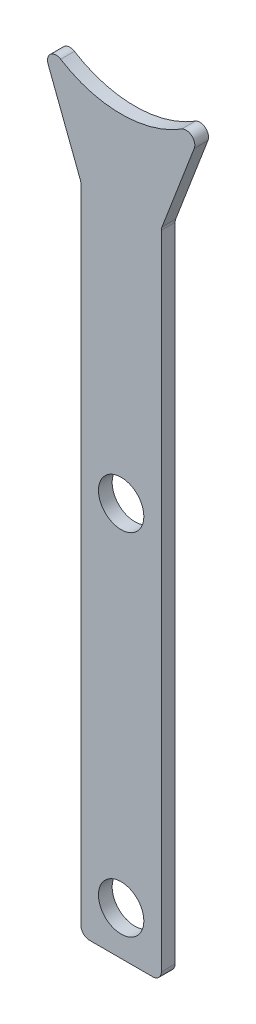
ISO-10303-21;
HEADER;
FILE_DESCRIPTION(('STEP AP214'),'2;1');
FILE_NAME('part.step','',(''),(''),'','','');
FILE_SCHEMA(('AUTOMOTIVE_DESIGN { 1 0 10303 214 1 1 1 1 }'));
ENDSEC;
DATA;
#1=APPLICATION_CONTEXT('core data for automotive mechanical design processes');
#2=APPLICATION_PROTOCOL_DEFINITION('international standard','automotive_design',2000,#1);
#3=PRODUCT_CONTEXT('',#1,'mechanical');
#4=PRODUCT('Part','Part','',(#3));
#5=PRODUCT_RELATED_PRODUCT_CATEGORY('part','',(#4));
#6=PRODUCT_DEFINITION_FORMATION('','',#4);
#7=PRODUCT_DEFINITION_CONTEXT('part definition',#1,'design');
#8=PRODUCT_DEFINITION('design','',#6,#7);
#9=PRODUCT_DEFINITION_SHAPE('','',#8);
#10=(LENGTH_UNIT() NAMED_UNIT(*) SI_UNIT(.MILLI.,.METRE.));
#11=(NAMED_UNIT(*) PLANE_ANGLE_UNIT() SI_UNIT($,.RADIAN.));
#12=(NAMED_UNIT(*) SI_UNIT($,.STERADIAN.) SOLID_ANGLE_UNIT());
#13=UNCERTAINTY_MEASURE_WITH_UNIT(LENGTH_MEASURE(1.E-05),#10,'distance_accuracy_value','');
#14=(GEOMETRIC_REPRESENTATION_CONTEXT(3) GLOBAL_UNCERTAINTY_ASSIGNED_CONTEXT((#13)) GLOBAL_UNIT_ASSIGNED_CONTEXT((#10,
#11,#12)) REPRESENTATION_CONTEXT('',''));
#15=CARTESIAN_POINT('',(0.,0.,0.));
#16=DIRECTION('',(0.,0.,1.));
#17=DIRECTION('',(1.,0.,0.));
#18=AXIS2_PLACEMENT_3D('',#15,#16,#17);
#19=CARTESIAN_POINT('',(-1.4426396734848,66.8892607458822,1.5875));
#20=DIRECTION('',(0.,0.,1.));
#21=DIRECTION('',(1.,0.,0.));
#22=AXIS2_PLACEMENT_3D('',#19,#20,#21);
#23=PLANE('',#22);
#24=CARTESIAN_POINT('',(-1.4426396734848,14.6841741500665,1.5875));
#25=DIRECTION('',(0.,0.,1.));
#26=DIRECTION('',(1.,0.,0.));
#27=AXIS2_PLACEMENT_3D('',#24,#25,#26);
#28=CIRCLE('',#27,2.62500000000001);
#29=CARTESIAN_POINT('',(1.18236032651521,14.6841741500665,1.5875));
#30=VERTEX_POINT('',#29);
#31=EDGE_CURVE('E243',#30,#30,#28,.T.);
#32=ORIENTED_EDGE('',*,*,#31,.F.);
#33=EDGE_LOOP('',(#32));
#34=FACE_BOUND('',#33,.T.);
#35=DIRECTION('',(0.,-1.,0.));
#36=VECTOR('',#35,1.);
#37=CARTESIAN_POINT('',(-6.09963967348479,-30.9023126875583,1.5875));
#38=LINE('',#37,#36);
#39=CARTESIAN_POINT('',(-6.09963967348479,44.3783348947431,1.5875));
#40=VERTEX_POINT('',#39);
#41=CARTESIAN_POINT('',(-6.09963967348479,-29.9023126875583,1.5875));
#42=VERTEX_POINT('',#41);
#43=EDGE_CURVE('E265',#40,#42,#38,.T.);
#44=ORIENTED_EDGE('',*,*,#43,.T.);
#45=CARTESIAN_POINT('',(-5.09963967348479,-29.9023126875583,1.5875));
#46=DIRECTION('',(0.,0.,1.));
#47=DIRECTION('',(1.,0.,0.));
#48=AXIS2_PLACEMENT_3D('',#45,#46,#47);
#49=CIRCLE('',#48,1.);
#50=CARTESIAN_POINT('',(-5.09963967348479,-30.9023126875583,1.5875));
#51=VERTEX_POINT('',#50);
#52=EDGE_CURVE('E194',#42,#51,#49,.T.);
#53=ORIENTED_EDGE('',*,*,#52,.T.);
#54=DIRECTION('',(1.,0.,0.));
#55=VECTOR('',#54,1.);
#56=CARTESIAN_POINT('',(3.21436032651521,-30.9023126875583,1.5875));
#57=LINE('',#56,#55);
#58=CARTESIAN_POINT('',(2.21436032651521,-30.9023126875583,1.5875));
#59=VERTEX_POINT('',#58);
#60=EDGE_CURVE('E151',#51,#59,#57,.T.);
#61=ORIENTED_EDGE('',*,*,#60,.T.);
#62=CARTESIAN_POINT('',(2.21436032651521,-29.9023126875583,1.5875));
#63=DIRECTION('',(0.,0.,1.));
#64=DIRECTION('',(1.,0.,0.));
#65=AXIS2_PLACEMENT_3D('',#62,#63,#64);
#66=CIRCLE('',#65,1.);
#67=CARTESIAN_POINT('',(3.21436032651521,-29.9023126875583,1.5875));
#68=VERTEX_POINT('',#67);
#69=EDGE_CURVE('E191',#59,#68,#66,.T.);
#70=ORIENTED_EDGE('',*,*,#69,.T.);
#71=DIRECTION('',(0.,1.,0.));
#72=VECTOR('',#71,1.);
#73=CARTESIAN_POINT('',(3.21436032651521,-30.9023126875583,1.5875));
#74=LINE('',#73,#72);
#75=CARTESIAN_POINT('',(3.2143603265152,44.3783348947431,1.5875));
#76=VERTEX_POINT('',#75);
#77=EDGE_CURVE('E160',#68,#76,#74,.T.);
#78=ORIENTED_EDGE('',*,*,#77,.T.);
#79=CARTESIAN_POINT('',(4.2143603265152,44.3783348947431,1.5875));
#80=DIRECTION('',(0.,0.,1.));
#81=DIRECTION('',(1.,0.,0.));
#82=AXIS2_PLACEMENT_3D('',#79,#80,#81);
#83=CIRCLE('',#82,1.);
#84=CARTESIAN_POINT('',(3.28051233790704,44.7360050419073,1.5875));
#85=VERTEX_POINT('',#84);
#86=EDGE_CURVE('E11',#76,#85,#83,.F.);
#87=ORIENTED_EDGE('',*,*,#86,.T.);
#88=DIRECTION('',(0.35767014716424,0.933847988608163,0.));
#89=VECTOR('',#88,1.);
#90=CARTESIAN_POINT('',(3.2143603265152,44.5632874604417,1.5875));
#91=LINE('',#90,#89);
#92=CARTESIAN_POINT('',(7.01135624072271,54.4769384188704,1.5875));
#93=VERTEX_POINT('',#92);
#94=EDGE_CURVE('E166',#85,#93,#91,.T.);
#95=ORIENTED_EDGE('',*,*,#94,.T.);
#96=CARTESIAN_POINT('',(6.07750825211454,54.8346085660346,1.5875));
#97=DIRECTION('',(0.,0.,1.));
#98=DIRECTION('',(1.,0.,0.));
#99=AXIS2_PLACEMENT_3D('',#96,#97,#98);
#100=CIRCLE('',#99,1.);
#101=CARTESIAN_POINT('',(5.54821856140513,55.6830497386027,1.5875));
#102=VERTEX_POINT('',#101);
#103=EDGE_CURVE('E186',#93,#102,#100,.T.);
#104=ORIENTED_EDGE('',*,*,#103,.T.);
#105=CARTESIAN_POINT('',(-1.4426396734848,66.8892607458822,1.5875));
#106=DIRECTION('',(0.,0.,-1.));
#107=DIRECTION('',(1.,0.,0.));
#108=AXIS2_PLACEMENT_3D('',#105,#106,#107);
#109=CIRCLE('',#108,13.208);
#110=CARTESIAN_POINT('',(-8.43349790837472,55.6830497386027,1.5875));
#111=VERTEX_POINT('',#110);
#112=EDGE_CURVE('E256',#102,#111,#109,.T.);
#113=ORIENTED_EDGE('',*,*,#112,.T.);
#114=CARTESIAN_POINT('',(-8.96278759908414,54.8346085660346,1.5875));
#115=DIRECTION('',(0.,0.,1.));
#116=DIRECTION('',(1.,0.,0.));
#117=AXIS2_PLACEMENT_3D('',#114,#115,#116);
#118=CIRCLE('',#117,1.);
#119=CARTESIAN_POINT('',(-9.8966355876923,54.4769384188704,1.5875));
#120=VERTEX_POINT('',#119);
#121=EDGE_CURVE('E62',#111,#120,#118,.T.);
#122=ORIENTED_EDGE('',*,*,#121,.T.);
#123=DIRECTION('',(0.357670147164241,-0.933847988608162,0.));
#124=VECTOR('',#123,1.);
#125=CARTESIAN_POINT('',(-11.2712953643843,58.0660645387389,1.5875));
#126=LINE('',#125,#124);
#127=CARTESIAN_POINT('',(-6.16579168487663,44.7360050419073,1.5875));
#128=VERTEX_POINT('',#127);
#129=EDGE_CURVE('E259',#120,#128,#126,.T.);
#130=ORIENTED_EDGE('',*,*,#129,.T.);
#131=CARTESIAN_POINT('',(-7.09963967348479,44.3783348947431,1.5875));
#132=DIRECTION('',(0.,0.,1.));
#133=DIRECTION('',(1.,0.,0.));
#134=AXIS2_PLACEMENT_3D('',#131,#132,#133);
#135=CIRCLE('',#134,1.);
#136=EDGE_CURVE('E227',#128,#40,#135,.F.);
#137=ORIENTED_EDGE('',*,*,#136,.T.);
#138=EDGE_LOOP('',(#44,#53,#61,#70,#78,#87,#95,#104,#113,#122,#130,#137));
#139=FACE_BOUND('',#138,.T.);
#140=CARTESIAN_POINT('',(-1.44263967348479,-25.82882282869,1.5875));
#141=DIRECTION('',(0.,0.,1.));
#142=DIRECTION('',(1.,0.,0.));
#143=AXIS2_PLACEMENT_3D('',#140,#141,#142);
#144=CIRCLE('',#143,2.625);
#145=CARTESIAN_POINT('',(1.1823603265152,-25.82882282869,1.5875));
#146=VERTEX_POINT('',#145);
#147=EDGE_CURVE('E319',#146,#146,#144,.T.);
#148=ORIENTED_EDGE('',*,*,#147,.F.);
#149=EDGE_LOOP('',(#148));
#150=FACE_BOUND('',#149,.T.);
#151=ADVANCED_FACE('F39',(#34,#139,#150),#23,.T.);
#152=CARTESIAN_POINT('',(-1.4426396734848,66.8892607458822,0.));
#153=DIRECTION('',(0.,0.,1.));
#154=DIRECTION('',(1.,0.,0.));
#155=AXIS2_PLACEMENT_3D('',#152,#153,#154);
#156=PLANE('',#155);
#157=DIRECTION('',(1.,0.,0.));
#158=VECTOR('',#157,1.);
#159=CARTESIAN_POINT('',(3.21436032651521,-30.9023126875583,0.));
#160=LINE('',#159,#158);
#161=CARTESIAN_POINT('',(-5.09963967348479,-30.9023126875583,0.));
#162=VERTEX_POINT('',#161);
#163=CARTESIAN_POINT('',(2.21436032651521,-30.9023126875583,0.));
#164=VERTEX_POINT('',#163);
#165=EDGE_CURVE('E148',#162,#164,#160,.T.);
#166=ORIENTED_EDGE('',*,*,#165,.F.);
#167=CARTESIAN_POINT('',(-5.09963967348479,-29.9023126875583,0.));
#168=DIRECTION('',(0.,0.,1.));
#169=DIRECTION('',(1.,0.,0.));
#170=AXIS2_PLACEMENT_3D('',#167,#168,#169);
#171=CIRCLE('',#170,1.);
#172=CARTESIAN_POINT('',(-6.09963967348479,-29.9023126875583,0.));
#173=VERTEX_POINT('',#172);
#174=EDGE_CURVE('E130',#162,#173,#171,.F.);
#175=ORIENTED_EDGE('',*,*,#174,.T.);
#176=DIRECTION('',(0.,-1.,0.));
#177=VECTOR('',#176,1.);
#178=CARTESIAN_POINT('',(-6.09963967348479,-30.9023126875583,0.));
#179=LINE('',#178,#177);
#180=CARTESIAN_POINT('',(-6.09963967348479,44.3783348947431,0.));
#181=VERTEX_POINT('',#180);
#182=EDGE_CURVE('E161',#181,#173,#179,.T.);
#183=ORIENTED_EDGE('',*,*,#182,.F.);
#184=CARTESIAN_POINT('',(-7.09963967348479,44.3783348947431,0.));
#185=DIRECTION('',(0.,0.,1.));
#186=DIRECTION('',(1.,0.,0.));
#187=AXIS2_PLACEMENT_3D('',#184,#185,#186);
#188=CIRCLE('',#187,1.);
#189=CARTESIAN_POINT('',(-6.16579168487663,44.7360050419073,0.));
#190=VERTEX_POINT('',#189);
#191=EDGE_CURVE('E224',#181,#190,#188,.T.);
#192=ORIENTED_EDGE('',*,*,#191,.T.);
#193=DIRECTION('',(0.357670147164241,-0.933847988608162,0.));
#194=VECTOR('',#193,1.);
#195=CARTESIAN_POINT('',(-11.2712953643843,58.0660645387389,0.));
#196=LINE('',#195,#194);
#197=CARTESIAN_POINT('',(-9.8966355876923,54.4769384188704,0.));
#198=VERTEX_POINT('',#197);
#199=EDGE_CURVE('E168',#198,#190,#196,.T.);
#200=ORIENTED_EDGE('',*,*,#199,.F.);
#201=CARTESIAN_POINT('',(-8.96278759908414,54.8346085660346,0.));
#202=DIRECTION('',(0.,0.,1.));
#203=DIRECTION('',(1.,0.,0.));
#204=AXIS2_PLACEMENT_3D('',#201,#202,#203);
#205=CIRCLE('',#204,1.);
#206=CARTESIAN_POINT('',(-8.43349790837472,55.6830497386027,0.));
#207=VERTEX_POINT('',#206);
#208=EDGE_CURVE('E176',#198,#207,#205,.F.);
#209=ORIENTED_EDGE('',*,*,#208,.T.);
#210=CARTESIAN_POINT('',(-1.4426396734848,66.8892607458822,0.));
#211=DIRECTION('',(0.,0.,-1.));
#212=DIRECTION('',(1.,0.,0.));
#213=AXIS2_PLACEMENT_3D('',#210,#211,#212);
#214=CIRCLE('',#213,13.208);
#215=CARTESIAN_POINT('',(5.54821856140513,55.6830497386027,0.));
#216=VERTEX_POINT('',#215);
#217=EDGE_CURVE('E272',#216,#207,#214,.T.);
#218=ORIENTED_EDGE('',*,*,#217,.F.);
#219=CARTESIAN_POINT('',(6.07750825211454,54.8346085660346,0.));
#220=DIRECTION('',(0.,0.,1.));
#221=DIRECTION('',(1.,0.,0.));
#222=AXIS2_PLACEMENT_3D('',#219,#220,#221);
#223=CIRCLE('',#222,1.);
#224=CARTESIAN_POINT('',(7.01135624072271,54.4769384188704,0.));
#225=VERTEX_POINT('',#224);
#226=EDGE_CURVE('E153',#216,#225,#223,.F.);
#227=ORIENTED_EDGE('',*,*,#226,.T.);
#228=DIRECTION('',(0.35767014716424,0.933847988608163,0.));
#229=VECTOR('',#228,1.);
#230=CARTESIAN_POINT('',(3.2143603265152,44.5632874604417,0.));
#231=LINE('',#230,#229);
#232=CARTESIAN_POINT('',(3.28051233790704,44.7360050419073,0.));
#233=VERTEX_POINT('',#232);
#234=EDGE_CURVE('E234',#233,#225,#231,.T.);
#235=ORIENTED_EDGE('',*,*,#234,.F.);
#236=CARTESIAN_POINT('',(4.2143603265152,44.3783348947431,0.));
#237=DIRECTION('',(0.,0.,1.));
#238=DIRECTION('',(1.,0.,0.));
#239=AXIS2_PLACEMENT_3D('',#236,#237,#238);
#240=CIRCLE('',#239,1.);
#241=CARTESIAN_POINT('',(3.2143603265152,44.3783348947431,0.));
#242=VERTEX_POINT('',#241);
#243=EDGE_CURVE('E48',#233,#242,#240,.T.);
#244=ORIENTED_EDGE('',*,*,#243,.T.);
#245=DIRECTION('',(0.,1.,0.));
#246=VECTOR('',#245,1.);
#247=CARTESIAN_POINT('',(3.21436032651521,-30.9023126875583,0.));
#248=LINE('',#247,#246);
#249=CARTESIAN_POINT('',(3.21436032651521,-29.9023126875583,0.));
#250=VERTEX_POINT('',#249);
#251=EDGE_CURVE('E232',#250,#242,#248,.T.);
#252=ORIENTED_EDGE('',*,*,#251,.F.);
#253=CARTESIAN_POINT('',(2.21436032651521,-29.9023126875583,0.));
#254=DIRECTION('',(0.,0.,1.));
#255=DIRECTION('',(1.,0.,0.));
#256=AXIS2_PLACEMENT_3D('',#253,#254,#255);
#257=CIRCLE('',#256,1.);
#258=EDGE_CURVE('E142',#250,#164,#257,.F.);
#259=ORIENTED_EDGE('',*,*,#258,.T.);
#260=EDGE_LOOP('',(#166,#175,#183,#192,#200,#209,#218,#227,#235,#244,#252,#259));
#261=FACE_BOUND('',#260,.T.);
#262=CARTESIAN_POINT('',(-1.4426396734848,14.6841741500665,0.));
#263=DIRECTION('',(0.,0.,1.));
#264=DIRECTION('',(1.,0.,0.));
#265=AXIS2_PLACEMENT_3D('',#262,#263,#264);
#266=CIRCLE('',#265,2.62500000000001);
#267=CARTESIAN_POINT('',(1.18236032651521,14.6841741500665,0.));
#268=VERTEX_POINT('',#267);
#269=EDGE_CURVE('E327',#268,#268,#266,.T.);
#270=ORIENTED_EDGE('',*,*,#269,.T.);
#271=EDGE_LOOP('',(#270));
#272=FACE_BOUND('',#271,.T.);
#273=CARTESIAN_POINT('',(-1.44263967348479,-25.82882282869,0.));
#274=DIRECTION('',(0.,0.,1.));
#275=DIRECTION('',(1.,0.,0.));
#276=AXIS2_PLACEMENT_3D('',#273,#274,#275);
#277=CIRCLE('',#276,2.625);
#278=CARTESIAN_POINT('',(1.1823603265152,-25.82882282869,0.));
#279=VERTEX_POINT('',#278);
#280=EDGE_CURVE('E322',#279,#279,#277,.T.);
#281=ORIENTED_EDGE('',*,*,#280,.T.);
#282=EDGE_LOOP('',(#281));
#283=FACE_BOUND('',#282,.T.);
#284=ADVANCED_FACE('F156',(#261,#272,#283),#156,.F.);
#285=CARTESIAN_POINT('',(3.21436032651521,-30.9023126875583,1.5875));
#286=DIRECTION('',(-1.,0.,0.));
#287=DIRECTION('',(0.,-1.,0.));
#288=AXIS2_PLACEMENT_3D('',#285,#286,#287);
#289=PLANE('',#288);
#290=ORIENTED_EDGE('',*,*,#77,.F.);
#291=DIRECTION('',(0.,0.,-1.));
#292=VECTOR('',#291,1.);
#293=CARTESIAN_POINT('',(3.21436032651521,-29.9023126875583,1.5875));
#294=LINE('',#293,#292);
#295=EDGE_CURVE('E200',#68,#250,#294,.T.);
#296=ORIENTED_EDGE('',*,*,#295,.T.);
#297=ORIENTED_EDGE('',*,*,#251,.T.);
#298=DIRECTION('',(0.,0.,-1.));
#299=VECTOR('',#298,1.);
#300=CARTESIAN_POINT('',(3.2143603265152,44.3783348947431,1.5875));
#301=LINE('',#300,#299);
#302=EDGE_CURVE('E197',#242,#76,#301,.F.);
#303=ORIENTED_EDGE('',*,*,#302,.T.);
#304=EDGE_LOOP('',(#290,#296,#297,#303));
#305=FACE_BOUND('',#304,.T.);
#306=ADVANCED_FACE('F240',(#305),#289,.F.);
#307=CARTESIAN_POINT('',(3.2143603265152,44.5632874604417,1.5875));
#308=DIRECTION('',(-0.933847988608163,0.35767014716424,0.));
#309=DIRECTION('',(-0.35767014716424,-0.933847988608163,0.));
#310=AXIS2_PLACEMENT_3D('',#307,#308,#309);
#311=PLANE('',#310);
#312=ORIENTED_EDGE('',*,*,#94,.F.);
#313=DIRECTION('',(0.,0.,-1.));
#314=VECTOR('',#313,1.);
#315=CARTESIAN_POINT('',(3.28051233790704,44.7360050419073,0.));
#316=LINE('',#315,#314);
#317=EDGE_CURVE('E213',#85,#233,#316,.T.);
#318=ORIENTED_EDGE('',*,*,#317,.T.);
#319=ORIENTED_EDGE('',*,*,#234,.T.);
#320=DIRECTION('',(0.,0.,-1.));
#321=VECTOR('',#320,1.);
#322=CARTESIAN_POINT('',(7.01135624072271,54.4769384188704,1.5875));
#323=LINE('',#322,#321);
#324=EDGE_CURVE('E210',#225,#93,#323,.F.);
#325=ORIENTED_EDGE('',*,*,#324,.T.);
#326=EDGE_LOOP('',(#312,#318,#319,#325));
#327=FACE_BOUND('',#326,.T.);
#328=ADVANCED_FACE('F253',(#327),#311,.F.);
#329=CARTESIAN_POINT('',(-1.4426396734848,66.8892607458822,1.5875));
#330=DIRECTION('',(0.,0.,-1.));
#331=DIRECTION('',(-1.,0.,0.));
#332=AXIS2_PLACEMENT_3D('',#329,#330,#331);
#333=CYLINDRICAL_SURFACE('',#332,13.208);
#334=ORIENTED_EDGE('',*,*,#217,.T.);
#335=DIRECTION('',(0.,0.,-1.));
#336=VECTOR('',#335,1.);
#337=CARTESIAN_POINT('',(-8.43349790837472,55.6830497386027,1.5875));
#338=LINE('',#337,#336);
#339=EDGE_CURVE('E221',#207,#111,#338,.F.);
#340=ORIENTED_EDGE('',*,*,#339,.T.);
#341=ORIENTED_EDGE('',*,*,#112,.F.);
#342=DIRECTION('',(0.,0.,-1.));
#343=VECTOR('',#342,1.);
#344=CARTESIAN_POINT('',(5.54821856140514,55.6830497386027,1.5875));
#345=LINE('',#344,#343);
#346=EDGE_CURVE('E217',#102,#216,#345,.T.);
#347=ORIENTED_EDGE('',*,*,#346,.T.);
#348=EDGE_LOOP('',(#334,#340,#341,#347));
#349=FACE_BOUND('',#348,.T.);
#350=ADVANCED_FACE('F294',(#349),#333,.F.);
#351=CARTESIAN_POINT('',(-11.2712953643843,58.0660645387389,1.5875));
#352=DIRECTION('',(0.933847988608162,0.357670147164241,0.));
#353=DIRECTION('',(-0.357670147164241,0.933847988608162,0.));
#354=AXIS2_PLACEMENT_3D('',#351,#352,#353);
#355=PLANE('',#354);
#356=ORIENTED_EDGE('',*,*,#199,.T.);
#357=DIRECTION('',(0.,0.,-1.));
#358=VECTOR('',#357,1.);
#359=CARTESIAN_POINT('',(-6.16579168487663,44.7360050419073,1.5875));
#360=LINE('',#359,#358);
#361=EDGE_CURVE('E55',#190,#128,#360,.F.);
#362=ORIENTED_EDGE('',*,*,#361,.T.);
#363=ORIENTED_EDGE('',*,*,#129,.F.);
#364=DIRECTION('',(0.,0.,-1.));
#365=VECTOR('',#364,1.);
#366=CARTESIAN_POINT('',(-9.8966355876923,54.4769384188704,1.5875));
#367=LINE('',#366,#365);
#368=EDGE_CURVE('E204',#120,#198,#367,.T.);
#369=ORIENTED_EDGE('',*,*,#368,.T.);
#370=EDGE_LOOP('',(#356,#362,#363,#369));
#371=FACE_BOUND('',#370,.T.);
#372=ADVANCED_FACE('F277',(#371),#355,.F.);
#373=CARTESIAN_POINT('',(-6.09963967348479,-30.9023126875583,1.5875));
#374=DIRECTION('',(1.,0.,0.));
#375=DIRECTION('',(0.,1.,0.));
#376=AXIS2_PLACEMENT_3D('',#373,#374,#375);
#377=PLANE('',#376);
#378=ORIENTED_EDGE('',*,*,#182,.T.);
#379=DIRECTION('',(0.,0.,-1.));
#380=VECTOR('',#379,1.);
#381=CARTESIAN_POINT('',(-6.09963967348479,-29.9023126875583,1.5875));
#382=LINE('',#381,#380);
#383=EDGE_CURVE('E135',#173,#42,#382,.F.);
#384=ORIENTED_EDGE('',*,*,#383,.T.);
#385=ORIENTED_EDGE('',*,*,#43,.F.);
#386=DIRECTION('',(0.,0.,-1.));
#387=VECTOR('',#386,1.);
#388=CARTESIAN_POINT('',(-6.09963967348479,44.3783348947431,0.));
#389=LINE('',#388,#387);
#390=EDGE_CURVE('E141',#40,#181,#389,.T.);
#391=ORIENTED_EDGE('',*,*,#390,.T.);
#392=EDGE_LOOP('',(#378,#384,#385,#391));
#393=FACE_BOUND('',#392,.T.);
#394=ADVANCED_FACE('F285',(#393),#377,.F.);
#395=CARTESIAN_POINT('',(3.21436032651521,-30.9023126875583,1.5875));
#396=DIRECTION('',(0.,1.,0.));
#397=DIRECTION('',(0.,0.,1.));
#398=AXIS2_PLACEMENT_3D('',#395,#396,#397);
#399=PLANE('',#398);
#400=ORIENTED_EDGE('',*,*,#60,.F.);
#401=DIRECTION('',(0.,0.,-1.));
#402=VECTOR('',#401,1.);
#403=CARTESIAN_POINT('',(-5.09963967348479,-30.9023126875583,1.5875));
#404=LINE('',#403,#402);
#405=EDGE_CURVE('E134',#51,#162,#404,.T.);
#406=ORIENTED_EDGE('',*,*,#405,.T.);
#407=ORIENTED_EDGE('',*,*,#165,.T.);
#408=DIRECTION('',(0.,0.,-1.));
#409=VECTOR('',#408,1.);
#410=CARTESIAN_POINT('',(2.21436032651521,-30.9023126875583,1.5875));
#411=LINE('',#410,#409);
#412=EDGE_CURVE('E154',#164,#59,#411,.F.);
#413=ORIENTED_EDGE('',*,*,#412,.T.);
#414=EDGE_LOOP('',(#400,#406,#407,#413));
#415=FACE_BOUND('',#414,.T.);
#416=ADVANCED_FACE('F147',(#415),#399,.F.);
#417=CARTESIAN_POINT('',(-1.4426396734848,14.6841741500665,1.5875));
#418=DIRECTION('',(0.,0.,-1.));
#419=DIRECTION('',(-1.,0.,0.));
#420=AXIS2_PLACEMENT_3D('',#417,#418,#419);
#421=CYLINDRICAL_SURFACE('',#420,2.62500000000001);
#422=ORIENTED_EDGE('',*,*,#31,.T.);
#423=EDGE_LOOP('',(#422));
#424=FACE_BOUND('',#423,.T.);
#425=ORIENTED_EDGE('',*,*,#269,.F.);
#426=EDGE_LOOP('',(#425));
#427=FACE_BOUND('',#426,.T.);
#428=ADVANCED_FACE('F292',(#424,#427),#421,.F.);
#429=CARTESIAN_POINT('',(-1.44263967348479,-25.82882282869,1.5875));
#430=DIRECTION('',(0.,0.,-1.));
#431=DIRECTION('',(-1.,0.,0.));
#432=AXIS2_PLACEMENT_3D('',#429,#430,#431);
#433=CYLINDRICAL_SURFACE('',#432,2.625);
#434=ORIENTED_EDGE('',*,*,#147,.T.);
#435=EDGE_LOOP('',(#434));
#436=FACE_BOUND('',#435,.T.);
#437=ORIENTED_EDGE('',*,*,#280,.F.);
#438=EDGE_LOOP('',(#437));
#439=FACE_BOUND('',#438,.T.);
#440=ADVANCED_FACE('F307',(#436,#439),#433,.F.);
#441=CARTESIAN_POINT('',(-5.09963967348479,-29.9023126875583,1.5875));
#442=DIRECTION('',(0.,0.,-1.));
#443=DIRECTION('',(-1.,0.,0.));
#444=AXIS2_PLACEMENT_3D('',#441,#442,#443);
#445=CYLINDRICAL_SURFACE('',#444,1.);
#446=ORIENTED_EDGE('',*,*,#52,.F.);
#447=ORIENTED_EDGE('',*,*,#383,.F.);
#448=ORIENTED_EDGE('',*,*,#174,.F.);
#449=ORIENTED_EDGE('',*,*,#405,.F.);
#450=EDGE_LOOP('',(#446,#447,#448,#449));
#451=FACE_BOUND('',#450,.T.);
#452=ADVANCED_FACE('F133',(#451),#445,.T.);
#453=CARTESIAN_POINT('',(2.21436032651521,-29.9023126875583,1.5875));
#454=DIRECTION('',(0.,0.,-1.));
#455=DIRECTION('',(-1.,0.,0.));
#456=AXIS2_PLACEMENT_3D('',#453,#454,#455);
#457=CYLINDRICAL_SURFACE('',#456,1.);
#458=ORIENTED_EDGE('',*,*,#69,.F.);
#459=ORIENTED_EDGE('',*,*,#412,.F.);
#460=ORIENTED_EDGE('',*,*,#258,.F.);
#461=ORIENTED_EDGE('',*,*,#295,.F.);
#462=EDGE_LOOP('',(#458,#459,#460,#461));
#463=FACE_BOUND('',#462,.T.);
#464=ADVANCED_FACE('F314',(#463),#457,.T.);
#465=CARTESIAN_POINT('',(-7.09963967348479,44.3783348947431,1.5875));
#466=DIRECTION('',(0.,0.,1.));
#467=DIRECTION('',(1.,0.,0.));
#468=AXIS2_PLACEMENT_3D('',#465,#466,#467);
#469=CYLINDRICAL_SURFACE('',#468,1.);
#470=ORIENTED_EDGE('',*,*,#136,.F.);
#471=ORIENTED_EDGE('',*,*,#361,.F.);
#472=ORIENTED_EDGE('',*,*,#191,.F.);
#473=ORIENTED_EDGE('',*,*,#390,.F.);
#474=EDGE_LOOP('',(#470,#471,#472,#473));
#475=FACE_BOUND('',#474,.T.);
#476=ADVANCED_FACE('F281',(#475),#469,.F.);
#477=CARTESIAN_POINT('',(4.2143603265152,44.3783348947431,1.5875));
#478=DIRECTION('',(0.,0.,1.));
#479=DIRECTION('',(1.,0.,0.));
#480=AXIS2_PLACEMENT_3D('',#477,#478,#479);
#481=CYLINDRICAL_SURFACE('',#480,1.);
#482=ORIENTED_EDGE('',*,*,#86,.F.);
#483=ORIENTED_EDGE('',*,*,#302,.F.);
#484=ORIENTED_EDGE('',*,*,#243,.F.);
#485=ORIENTED_EDGE('',*,*,#317,.F.);
#486=EDGE_LOOP('',(#482,#483,#484,#485));
#487=FACE_BOUND('',#486,.T.);
#488=ADVANCED_FACE('F246',(#487),#481,.F.);
#489=CARTESIAN_POINT('',(-8.96278759908414,54.8346085660346,1.5875));
#490=DIRECTION('',(0.,0.,-1.));
#491=DIRECTION('',(-1.,0.,0.));
#492=AXIS2_PLACEMENT_3D('',#489,#490,#491);
#493=CYLINDRICAL_SURFACE('',#492,1.);
#494=ORIENTED_EDGE('',*,*,#121,.F.);
#495=ORIENTED_EDGE('',*,*,#339,.F.);
#496=ORIENTED_EDGE('',*,*,#208,.F.);
#497=ORIENTED_EDGE('',*,*,#368,.F.);
#498=EDGE_LOOP('',(#494,#495,#496,#497));
#499=FACE_BOUND('',#498,.T.);
#500=ADVANCED_FACE('F347',(#499),#493,.T.);
#501=CARTESIAN_POINT('',(6.07750825211454,54.8346085660346,1.5875));
#502=DIRECTION('',(0.,0.,-1.));
#503=DIRECTION('',(-1.,0.,0.));
#504=AXIS2_PLACEMENT_3D('',#501,#502,#503);
#505=CYLINDRICAL_SURFACE('',#504,1.);
#506=ORIENTED_EDGE('',*,*,#103,.F.);
#507=ORIENTED_EDGE('',*,*,#324,.F.);
#508=ORIENTED_EDGE('',*,*,#226,.F.);
#509=ORIENTED_EDGE('',*,*,#346,.F.);
#510=EDGE_LOOP('',(#506,#507,#508,#509));
#511=FACE_BOUND('',#510,.T.);
#512=ADVANCED_FACE('F41',(#511),#505,.T.);
#513=CLOSED_SHELL('',(#151,#284,#306,#328,#350,#372,#394,#416,#428,#440,#452,#464,#476,#488,
#500,#512));
#514=MANIFOLD_SOLID_BREP('B2',#513);
#515=ADVANCED_BREP_SHAPE_REPRESENTATION('',(#18,#514),#14);
#516=SHAPE_DEFINITION_REPRESENTATION(#9,#515);
ENDSEC;
END-ISO-10303-21;
